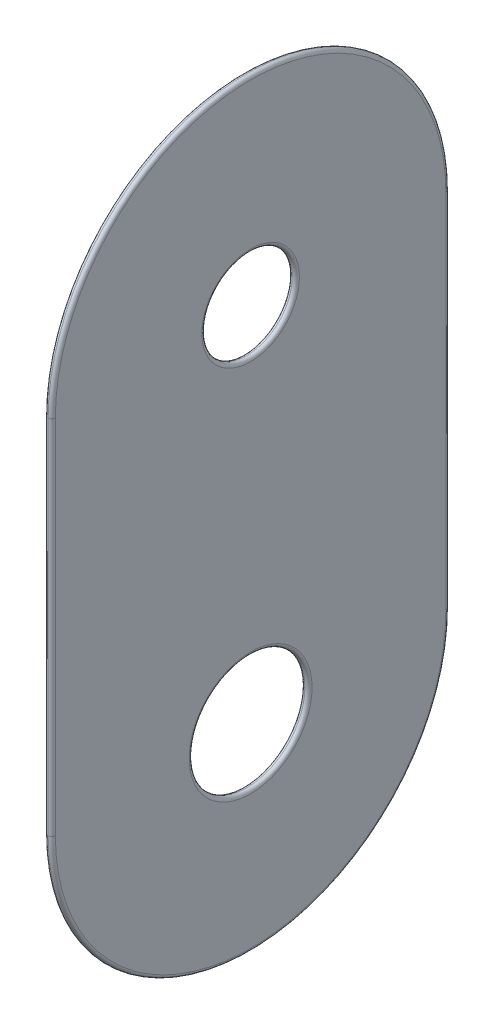
ISO-10303-21;
HEADER;
FILE_DESCRIPTION(('STEP AP214'),'2;1');
FILE_NAME('part.step','',(''),(''),'','','');
FILE_SCHEMA(('AUTOMOTIVE_DESIGN { 1 0 10303 214 1 1 1 1 }'));
ENDSEC;
DATA;
#1=APPLICATION_CONTEXT('core data for automotive mechanical design processes');
#2=APPLICATION_PROTOCOL_DEFINITION('international standard','automotive_design',2000,#1);
#3=PRODUCT_CONTEXT('',#1,'mechanical');
#4=PRODUCT('Part','Part','',(#3));
#5=PRODUCT_RELATED_PRODUCT_CATEGORY('part','',(#4));
#6=PRODUCT_DEFINITION_FORMATION('','',#4);
#7=PRODUCT_DEFINITION_CONTEXT('part definition',#1,'design');
#8=PRODUCT_DEFINITION('design','',#6,#7);
#9=PRODUCT_DEFINITION_SHAPE('','',#8);
#10=(LENGTH_UNIT() NAMED_UNIT(*) SI_UNIT(.MILLI.,.METRE.));
#11=(NAMED_UNIT(*) PLANE_ANGLE_UNIT() SI_UNIT($,.RADIAN.));
#12=(NAMED_UNIT(*) SI_UNIT($,.STERADIAN.) SOLID_ANGLE_UNIT());
#13=UNCERTAINTY_MEASURE_WITH_UNIT(LENGTH_MEASURE(1.E-05),#10,'distance_accuracy_value','');
#14=(GEOMETRIC_REPRESENTATION_CONTEXT(3) GLOBAL_UNCERTAINTY_ASSIGNED_CONTEXT((#13)) GLOBAL_UNIT_ASSIGNED_CONTEXT((#10,
#11,#12)) REPRESENTATION_CONTEXT('',''));
#15=CARTESIAN_POINT('',(0.,0.,0.));
#16=DIRECTION('',(0.,0.,1.));
#17=DIRECTION('',(1.,0.,0.));
#18=AXIS2_PLACEMENT_3D('',#15,#16,#17);
#19=CARTESIAN_POINT('',(0.254,12.7,0.));
#20=DIRECTION('',(1.,0.,0.));
#21=DIRECTION('',(0.,0.,-1.));
#22=AXIS2_PLACEMENT_3D('',#19,#20,#21);
#23=PLANE('',#22);
#24=CARTESIAN_POINT('',(0.254,-12.7,0.));
#25=DIRECTION('',(1.,0.,0.));
#26=DIRECTION('',(0.,0.,-1.));
#27=AXIS2_PLACEMENT_3D('',#24,#25,#26);
#28=CIRCLE('',#27,4.318);
#29=CARTESIAN_POINT('',(0.254,-12.7,-4.318));
#30=VERTEX_POINT('',#29);
#31=EDGE_CURVE('E134',#30,#30,#28,.F.);
#32=ORIENTED_EDGE('',*,*,#31,.T.);
#33=EDGE_LOOP('',(#32));
#34=FACE_BOUND('',#33,.T.);
#35=CARTESIAN_POINT('',(0.254,-12.7,0.));
#36=DIRECTION('',(1.,0.,0.));
#37=DIRECTION('',(0.,0.,-1.));
#38=AXIS2_PLACEMENT_3D('',#35,#36,#37);
#39=CIRCLE('',#38,13.716);
#40=CARTESIAN_POINT('',(0.254,-12.7,13.716));
#41=VERTEX_POINT('',#40);
#42=CARTESIAN_POINT('',(0.254,-12.7,-13.716));
#43=VERTEX_POINT('',#42);
#44=EDGE_CURVE('E131',#41,#43,#39,.T.);
#45=ORIENTED_EDGE('',*,*,#44,.T.);
#46=DIRECTION('',(0.,1.,0.));
#47=VECTOR('',#46,1.);
#48=CARTESIAN_POINT('',(0.254,12.7,-13.716));
#49=LINE('',#48,#47);
#50=CARTESIAN_POINT('',(0.254,12.7,-13.716));
#51=VERTEX_POINT('',#50);
#52=EDGE_CURVE('E110',#43,#51,#49,.T.);
#53=ORIENTED_EDGE('',*,*,#52,.T.);
#54=CARTESIAN_POINT('',(0.254,12.7,0.));
#55=DIRECTION('',(1.,0.,0.));
#56=DIRECTION('',(0.,0.,-1.));
#57=AXIS2_PLACEMENT_3D('',#54,#55,#56);
#58=CIRCLE('',#57,13.716);
#59=CARTESIAN_POINT('',(0.254,12.7,13.716));
#60=VERTEX_POINT('',#59);
#61=EDGE_CURVE('E120',#51,#60,#58,.T.);
#62=ORIENTED_EDGE('',*,*,#61,.T.);
#63=DIRECTION('',(0.,-1.,0.));
#64=VECTOR('',#63,1.);
#65=CARTESIAN_POINT('',(0.254,-12.7,13.716));
#66=LINE('',#65,#64);
#67=EDGE_CURVE('E126',#60,#41,#66,.T.);
#68=ORIENTED_EDGE('',*,*,#67,.T.);
#69=EDGE_LOOP('',(#45,#53,#62,#68));
#70=FACE_BOUND('',#69,.T.);
#71=CARTESIAN_POINT('',(0.254,12.7,0.));
#72=DIRECTION('',(1.,0.,0.));
#73=DIRECTION('',(0.,0.,-1.));
#74=AXIS2_PLACEMENT_3D('',#71,#72,#73);
#75=CIRCLE('',#74,3.429);
#76=CARTESIAN_POINT('',(0.254,12.7,-3.429));
#77=VERTEX_POINT('',#76);
#78=EDGE_CURVE('E127',#77,#77,#75,.F.);
#79=ORIENTED_EDGE('',*,*,#78,.T.);
#80=EDGE_LOOP('',(#79));
#81=FACE_BOUND('',#80,.T.);
#82=ADVANCED_FACE('F38',(#34,#70,#81),#23,.T.);
#83=CARTESIAN_POINT('',(-0.254,12.7,0.));
#84=DIRECTION('',(1.,0.,0.));
#85=DIRECTION('',(0.,0.,-1.));
#86=AXIS2_PLACEMENT_3D('',#83,#84,#85);
#87=PLANE('',#86);
#88=CARTESIAN_POINT('',(-0.254,-12.7,0.));
#89=DIRECTION('',(1.,0.,0.));
#90=DIRECTION('',(0.,0.,-1.));
#91=AXIS2_PLACEMENT_3D('',#88,#89,#90);
#92=CIRCLE('',#91,4.318);
#93=CARTESIAN_POINT('',(-0.254,-12.7,-4.318));
#94=VERTEX_POINT('',#93);
#95=EDGE_CURVE('E11',#94,#94,#92,.T.);
#96=ORIENTED_EDGE('',*,*,#95,.T.);
#97=EDGE_LOOP('',(#96));
#98=FACE_BOUND('',#97,.T.);
#99=CARTESIAN_POINT('',(-0.254,12.7,0.));
#100=DIRECTION('',(1.,0.,0.));
#101=DIRECTION('',(0.,0.,-1.));
#102=AXIS2_PLACEMENT_3D('',#99,#100,#101);
#103=CIRCLE('',#102,3.429);
#104=CARTESIAN_POINT('',(-0.254,12.7,-3.429));
#105=VERTEX_POINT('',#104);
#106=EDGE_CURVE('E48',#105,#105,#103,.T.);
#107=ORIENTED_EDGE('',*,*,#106,.T.);
#108=EDGE_LOOP('',(#107));
#109=FACE_BOUND('',#108,.T.);
#110=CARTESIAN_POINT('',(-0.254,-12.7,0.));
#111=DIRECTION('',(1.,0.,0.));
#112=DIRECTION('',(0.,0.,-1.));
#113=AXIS2_PLACEMENT_3D('',#110,#111,#112);
#114=CIRCLE('',#113,13.716);
#115=CARTESIAN_POINT('',(-0.254,-12.7,-13.716));
#116=VERTEX_POINT('',#115);
#117=CARTESIAN_POINT('',(-0.254,-12.7,13.716));
#118=VERTEX_POINT('',#117);
#119=EDGE_CURVE('E59',#116,#118,#114,.F.);
#120=ORIENTED_EDGE('',*,*,#119,.T.);
#121=DIRECTION('',(0.,-1.,0.));
#122=VECTOR('',#121,1.);
#123=CARTESIAN_POINT('',(-0.254,12.7,13.716));
#124=LINE('',#123,#122);
#125=CARTESIAN_POINT('',(-0.254,12.7,13.716));
#126=VERTEX_POINT('',#125);
#127=EDGE_CURVE('E178',#118,#126,#124,.F.);
#128=ORIENTED_EDGE('',*,*,#127,.T.);
#129=CARTESIAN_POINT('',(-0.254,12.7,0.));
#130=DIRECTION('',(1.,0.,0.));
#131=DIRECTION('',(0.,0.,-1.));
#132=AXIS2_PLACEMENT_3D('',#129,#130,#131);
#133=CIRCLE('',#132,13.716);
#134=CARTESIAN_POINT('',(-0.254,12.7,-13.716));
#135=VERTEX_POINT('',#134);
#136=EDGE_CURVE('E161',#126,#135,#133,.F.);
#137=ORIENTED_EDGE('',*,*,#136,.T.);
#138=DIRECTION('',(0.,1.,0.));
#139=VECTOR('',#138,1.);
#140=CARTESIAN_POINT('',(-0.254,12.7,-13.716));
#141=LINE('',#140,#139);
#142=EDGE_CURVE('E66',#135,#116,#141,.F.);
#143=ORIENTED_EDGE('',*,*,#142,.T.);
#144=EDGE_LOOP('',(#120,#128,#137,#143));
#145=FACE_BOUND('',#144,.T.);
#146=ADVANCED_FACE('F205',(#98,#109,#145),#87,.F.);
#147=CARTESIAN_POINT('',(0.,-12.7,0.));
#148=DIRECTION('',(1.,0.,0.));
#149=DIRECTION('',(0.,0.,-1.));
#150=AXIS2_PLACEMENT_3D('',#147,#148,#149);
#151=TOROIDAL_SURFACE('',#150,4.318,0.254);
#152=ORIENTED_EDGE('',*,*,#31,.F.);
#153=EDGE_LOOP('',(#152));
#154=FACE_BOUND('',#153,.T.);
#155=CARTESIAN_POINT('',(0.,-12.7,0.));
#156=DIRECTION('',(1.,0.,0.));
#157=DIRECTION('',(0.,0.,-1.));
#158=AXIS2_PLACEMENT_3D('',#155,#156,#157);
#159=CIRCLE('',#158,4.064);
#160=CARTESIAN_POINT('',(0.,-12.7,-4.064));
#161=VERTEX_POINT('',#160);
#162=EDGE_CURVE('E171',#161,#161,#159,.T.);
#163=ORIENTED_EDGE('',*,*,#162,.F.);
#164=EDGE_LOOP('',(#163));
#165=FACE_BOUND('',#164,.T.);
#166=ADVANCED_FACE('F207',(#154,#165),#151,.T.);
#167=CARTESIAN_POINT('',(0.,12.7,13.716));
#168=DIRECTION('',(0.,1.,0.));
#169=DIRECTION('',(0.,0.,1.));
#170=AXIS2_PLACEMENT_3D('',#167,#168,#169);
#171=CYLINDRICAL_SURFACE('',#170,0.254);
#172=CARTESIAN_POINT('',(0.,12.7,13.716));
#173=DIRECTION('',(0.,1.,0.));
#174=DIRECTION('',(0.,0.,1.));
#175=AXIS2_PLACEMENT_3D('',#172,#173,#174);
#176=CIRCLE('',#175,0.254);
#177=CARTESIAN_POINT('',(0.,12.7,13.97));
#178=VERTEX_POINT('',#177);
#179=EDGE_CURVE('E122',#178,#60,#176,.T.);
#180=ORIENTED_EDGE('',*,*,#179,.F.);
#181=DIRECTION('',(0.,-1.,0.));
#182=VECTOR('',#181,1.);
#183=CARTESIAN_POINT('',(0.,12.7,13.97));
#184=LINE('',#183,#182);
#185=CARTESIAN_POINT('',(0.,-12.7,13.97));
#186=VERTEX_POINT('',#185);
#187=EDGE_CURVE('E150',#186,#178,#184,.F.);
#188=ORIENTED_EDGE('',*,*,#187,.F.);
#189=CARTESIAN_POINT('',(0.,-12.7,13.716));
#190=DIRECTION('',(0.,-1.,0.));
#191=DIRECTION('',(0.,0.,-1.));
#192=AXIS2_PLACEMENT_3D('',#189,#190,#191);
#193=CIRCLE('',#192,0.254);
#194=EDGE_CURVE('E167',#41,#186,#193,.T.);
#195=ORIENTED_EDGE('',*,*,#194,.F.);
#196=ORIENTED_EDGE('',*,*,#67,.F.);
#197=EDGE_LOOP('',(#180,#188,#195,#196));
#198=FACE_BOUND('',#197,.T.);
#199=ADVANCED_FACE('F214',(#198),#171,.T.);
#200=CARTESIAN_POINT('',(0.,-12.7,0.));
#201=DIRECTION('',(1.,0.,0.));
#202=DIRECTION('',(0.,0.,-1.));
#203=AXIS2_PLACEMENT_3D('',#200,#201,#202);
#204=TOROIDAL_SURFACE('',#203,13.716,0.254);
#205=ORIENTED_EDGE('',*,*,#194,.T.);
#206=CARTESIAN_POINT('',(0.,-12.7,0.));
#207=DIRECTION('',(1.,0.,0.));
#208=DIRECTION('',(0.,0.,-1.));
#209=AXIS2_PLACEMENT_3D('',#206,#207,#208);
#210=CIRCLE('',#209,13.97);
#211=CARTESIAN_POINT('',(0.,-12.7,-13.97));
#212=VERTEX_POINT('',#211);
#213=EDGE_CURVE('E147',#212,#186,#210,.F.);
#214=ORIENTED_EDGE('',*,*,#213,.F.);
#215=CARTESIAN_POINT('',(0.,-12.7,-13.716));
#216=DIRECTION('',(0.,1.,0.));
#217=DIRECTION('',(0.,0.,1.));
#218=AXIS2_PLACEMENT_3D('',#215,#216,#217);
#219=CIRCLE('',#218,0.254);
#220=EDGE_CURVE('E117',#43,#212,#219,.T.);
#221=ORIENTED_EDGE('',*,*,#220,.F.);
#222=ORIENTED_EDGE('',*,*,#44,.F.);
#223=EDGE_LOOP('',(#205,#214,#221,#222));
#224=FACE_BOUND('',#223,.T.);
#225=ADVANCED_FACE('F226',(#224),#204,.T.);
#226=CARTESIAN_POINT('',(0.,12.7,0.));
#227=DIRECTION('',(1.,0.,0.));
#228=DIRECTION('',(0.,0.,-1.));
#229=AXIS2_PLACEMENT_3D('',#226,#227,#228);
#230=TOROIDAL_SURFACE('',#229,13.716,0.254);
#231=ORIENTED_EDGE('',*,*,#179,.T.);
#232=ORIENTED_EDGE('',*,*,#61,.F.);
#233=CARTESIAN_POINT('',(0.,12.7,-13.716));
#234=DIRECTION('',(0.,-1.,0.));
#235=DIRECTION('',(0.,0.,-1.));
#236=AXIS2_PLACEMENT_3D('',#233,#234,#235);
#237=CIRCLE('',#236,0.254);
#238=CARTESIAN_POINT('',(0.,12.7,-13.97));
#239=VERTEX_POINT('',#238);
#240=EDGE_CURVE('E106',#239,#51,#237,.T.);
#241=ORIENTED_EDGE('',*,*,#240,.F.);
#242=CARTESIAN_POINT('',(0.,12.7,0.));
#243=DIRECTION('',(1.,0.,0.));
#244=DIRECTION('',(0.,0.,-1.));
#245=AXIS2_PLACEMENT_3D('',#242,#243,#244);
#246=CIRCLE('',#245,13.97);
#247=EDGE_CURVE('E154',#178,#239,#246,.F.);
#248=ORIENTED_EDGE('',*,*,#247,.F.);
#249=EDGE_LOOP('',(#231,#232,#241,#248));
#250=FACE_BOUND('',#249,.T.);
#251=ADVANCED_FACE('F121',(#250),#230,.T.);
#252=CARTESIAN_POINT('',(0.,12.7,-13.716));
#253=DIRECTION('',(0.,-1.,0.));
#254=DIRECTION('',(0.,0.,-1.));
#255=AXIS2_PLACEMENT_3D('',#252,#253,#254);
#256=CYLINDRICAL_SURFACE('',#255,0.254);
#257=ORIENTED_EDGE('',*,*,#220,.T.);
#258=DIRECTION('',(0.,1.,0.));
#259=VECTOR('',#258,1.);
#260=CARTESIAN_POINT('',(0.,-12.7,-13.97));
#261=LINE('',#260,#259);
#262=EDGE_CURVE('E112',#239,#212,#261,.F.);
#263=ORIENTED_EDGE('',*,*,#262,.F.);
#264=ORIENTED_EDGE('',*,*,#240,.T.);
#265=ORIENTED_EDGE('',*,*,#52,.F.);
#266=EDGE_LOOP('',(#257,#263,#264,#265));
#267=FACE_BOUND('',#266,.T.);
#268=ADVANCED_FACE('F108',(#267),#256,.T.);
#269=CARTESIAN_POINT('',(0.,12.7,0.));
#270=DIRECTION('',(1.,0.,0.));
#271=DIRECTION('',(0.,0.,-1.));
#272=AXIS2_PLACEMENT_3D('',#269,#270,#271);
#273=TOROIDAL_SURFACE('',#272,3.429,0.254);
#274=ORIENTED_EDGE('',*,*,#78,.F.);
#275=EDGE_LOOP('',(#274));
#276=FACE_BOUND('',#275,.T.);
#277=CARTESIAN_POINT('',(0.,12.7,0.));
#278=DIRECTION('',(1.,0.,0.));
#279=DIRECTION('',(0.,0.,-1.));
#280=AXIS2_PLACEMENT_3D('',#277,#278,#279);
#281=CIRCLE('',#280,3.175);
#282=CARTESIAN_POINT('',(0.,12.7,-3.175));
#283=VERTEX_POINT('',#282);
#284=EDGE_CURVE('E158',#283,#283,#281,.T.);
#285=ORIENTED_EDGE('',*,*,#284,.F.);
#286=EDGE_LOOP('',(#285));
#287=FACE_BOUND('',#286,.T.);
#288=ADVANCED_FACE('F223',(#276,#287),#273,.T.);
#289=CARTESIAN_POINT('',(0.,-12.7,0.));
#290=DIRECTION('',(1.,0.,0.));
#291=DIRECTION('',(0.,0.,-1.));
#292=AXIS2_PLACEMENT_3D('',#289,#290,#291);
#293=TOROIDAL_SURFACE('',#292,4.318,0.254);
#294=ORIENTED_EDGE('',*,*,#162,.T.);
#295=EDGE_LOOP('',(#294));
#296=FACE_BOUND('',#295,.T.);
#297=ORIENTED_EDGE('',*,*,#95,.F.);
#298=EDGE_LOOP('',(#297));
#299=FACE_BOUND('',#298,.T.);
#300=ADVANCED_FACE('F235',(#296,#299),#293,.T.);
#301=CARTESIAN_POINT('',(0.,12.7,0.));
#302=DIRECTION('',(1.,0.,0.));
#303=DIRECTION('',(0.,0.,-1.));
#304=AXIS2_PLACEMENT_3D('',#301,#302,#303);
#305=TOROIDAL_SURFACE('',#304,3.429,0.254);
#306=ORIENTED_EDGE('',*,*,#284,.T.);
#307=EDGE_LOOP('',(#306));
#308=FACE_BOUND('',#307,.T.);
#309=ORIENTED_EDGE('',*,*,#106,.F.);
#310=EDGE_LOOP('',(#309));
#311=FACE_BOUND('',#310,.T.);
#312=ADVANCED_FACE('F239',(#308,#311),#305,.T.);
#313=CARTESIAN_POINT('',(0.,12.7,-13.716));
#314=DIRECTION('',(0.,1.,0.));
#315=DIRECTION('',(0.,0.,1.));
#316=AXIS2_PLACEMENT_3D('',#313,#314,#315);
#317=CYLINDRICAL_SURFACE('',#316,0.254);
#318=CARTESIAN_POINT('',(0.,-12.7,-13.716));
#319=DIRECTION('',(0.,-1.,0.));
#320=DIRECTION('',(0.,0.,-1.));
#321=AXIS2_PLACEMENT_3D('',#318,#319,#320);
#322=CIRCLE('',#321,0.254);
#323=EDGE_CURVE('E189',#116,#212,#322,.T.);
#324=ORIENTED_EDGE('',*,*,#323,.F.);
#325=ORIENTED_EDGE('',*,*,#142,.F.);
#326=CARTESIAN_POINT('',(0.,12.7,-13.716));
#327=DIRECTION('',(0.,1.,0.));
#328=DIRECTION('',(0.,0.,1.));
#329=AXIS2_PLACEMENT_3D('',#326,#327,#328);
#330=CIRCLE('',#329,0.254);
#331=EDGE_CURVE('E42',#239,#135,#330,.T.);
#332=ORIENTED_EDGE('',*,*,#331,.F.);
#333=ORIENTED_EDGE('',*,*,#262,.T.);
#334=EDGE_LOOP('',(#324,#325,#332,#333));
#335=FACE_BOUND('',#334,.T.);
#336=ADVANCED_FACE('F40',(#335),#317,.T.);
#337=CARTESIAN_POINT('',(0.,12.7,0.));
#338=DIRECTION('',(1.,0.,0.));
#339=DIRECTION('',(0.,0.,-1.));
#340=AXIS2_PLACEMENT_3D('',#337,#338,#339);
#341=TOROIDAL_SURFACE('',#340,13.716,0.254);
#342=ORIENTED_EDGE('',*,*,#331,.T.);
#343=ORIENTED_EDGE('',*,*,#136,.F.);
#344=CARTESIAN_POINT('',(0.,12.7,13.716));
#345=DIRECTION('',(0.,-1.,0.));
#346=DIRECTION('',(0.,0.,-1.));
#347=AXIS2_PLACEMENT_3D('',#344,#345,#346);
#348=CIRCLE('',#347,0.254);
#349=EDGE_CURVE('E187',#178,#126,#348,.T.);
#350=ORIENTED_EDGE('',*,*,#349,.F.);
#351=ORIENTED_EDGE('',*,*,#247,.T.);
#352=EDGE_LOOP('',(#342,#343,#350,#351));
#353=FACE_BOUND('',#352,.T.);
#354=ADVANCED_FACE('F196',(#353),#341,.T.);
#355=CARTESIAN_POINT('',(0.,-12.7,0.));
#356=DIRECTION('',(1.,0.,0.));
#357=DIRECTION('',(0.,0.,-1.));
#358=AXIS2_PLACEMENT_3D('',#355,#356,#357);
#359=TOROIDAL_SURFACE('',#358,13.716,0.254);
#360=ORIENTED_EDGE('',*,*,#323,.T.);
#361=ORIENTED_EDGE('',*,*,#213,.T.);
#362=CARTESIAN_POINT('',(0.,-12.7,13.716));
#363=DIRECTION('',(0.,1.,0.));
#364=DIRECTION('',(0.,0.,1.));
#365=AXIS2_PLACEMENT_3D('',#362,#363,#364);
#366=CIRCLE('',#365,0.254);
#367=EDGE_CURVE('E184',#118,#186,#366,.T.);
#368=ORIENTED_EDGE('',*,*,#367,.F.);
#369=ORIENTED_EDGE('',*,*,#119,.F.);
#370=EDGE_LOOP('',(#360,#361,#368,#369));
#371=FACE_BOUND('',#370,.T.);
#372=ADVANCED_FACE('F200',(#371),#359,.T.);
#373=CARTESIAN_POINT('',(0.,12.7,13.716));
#374=DIRECTION('',(0.,-1.,0.));
#375=DIRECTION('',(0.,0.,-1.));
#376=AXIS2_PLACEMENT_3D('',#373,#374,#375);
#377=CYLINDRICAL_SURFACE('',#376,0.254);
#378=ORIENTED_EDGE('',*,*,#349,.T.);
#379=ORIENTED_EDGE('',*,*,#127,.F.);
#380=ORIENTED_EDGE('',*,*,#367,.T.);
#381=ORIENTED_EDGE('',*,*,#187,.T.);
#382=EDGE_LOOP('',(#378,#379,#380,#381));
#383=FACE_BOUND('',#382,.T.);
#384=ADVANCED_FACE('F204',(#383),#377,.T.);
#385=CLOSED_SHELL('',(#82,#146,#166,#199,#225,#251,#268,#288,#300,#312,#336,#354,#372,#384));
#386=MANIFOLD_SOLID_BREP('B2',#385);
#387=ADVANCED_BREP_SHAPE_REPRESENTATION('',(#18,#386),#14);
#388=SHAPE_DEFINITION_REPRESENTATION(#9,#387);
ENDSEC;
END-ISO-10303-21;
